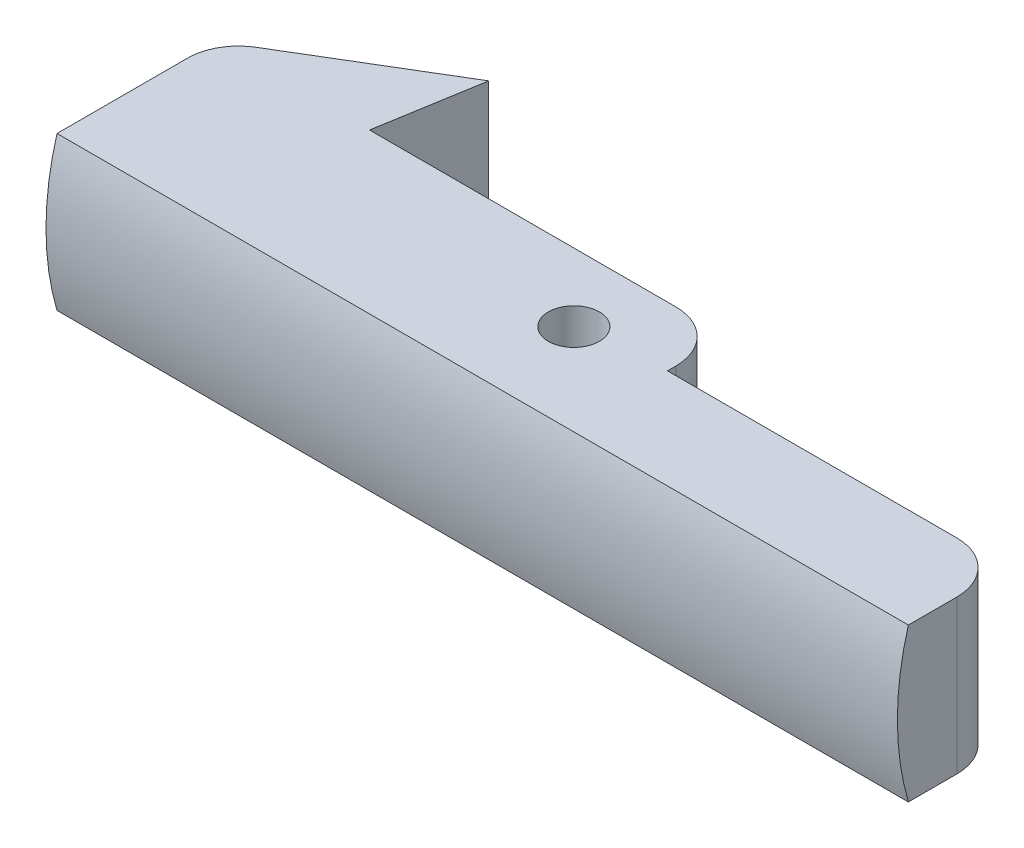
ISO-10303-21;
HEADER;
FILE_DESCRIPTION(('STEP AP214'),'2;1');
FILE_NAME('part.step','',(''),(''),'','','');
FILE_SCHEMA(('AUTOMOTIVE_DESIGN { 1 0 10303 214 1 1 1 1 }'));
ENDSEC;
DATA;
#1=APPLICATION_CONTEXT('core data for automotive mechanical design processes');
#2=APPLICATION_PROTOCOL_DEFINITION('international standard','automotive_design',2000,#1);
#3=PRODUCT_CONTEXT('',#1,'mechanical');
#4=PRODUCT('Part','Part','',(#3));
#5=PRODUCT_RELATED_PRODUCT_CATEGORY('part','',(#4));
#6=PRODUCT_DEFINITION_FORMATION('','',#4);
#7=PRODUCT_DEFINITION_CONTEXT('part definition',#1,'design');
#8=PRODUCT_DEFINITION('design','',#6,#7);
#9=PRODUCT_DEFINITION_SHAPE('','',#8);
#10=(LENGTH_UNIT() NAMED_UNIT(*) SI_UNIT(.MILLI.,.METRE.));
#11=(NAMED_UNIT(*) PLANE_ANGLE_UNIT() SI_UNIT($,.RADIAN.));
#12=(NAMED_UNIT(*) SI_UNIT($,.STERADIAN.) SOLID_ANGLE_UNIT());
#13=UNCERTAINTY_MEASURE_WITH_UNIT(LENGTH_MEASURE(1.E-05),#10,'distance_accuracy_value','');
#14=(GEOMETRIC_REPRESENTATION_CONTEXT(3) GLOBAL_UNCERTAINTY_ASSIGNED_CONTEXT((#13)) GLOBAL_UNIT_ASSIGNED_CONTEXT((#10,
#11,#12)) REPRESENTATION_CONTEXT('',''));
#15=CARTESIAN_POINT('',(0.,0.,0.));
#16=DIRECTION('',(0.,0.,1.));
#17=DIRECTION('',(1.,0.,0.));
#18=AXIS2_PLACEMENT_3D('',#15,#16,#17);
#19=CARTESIAN_POINT('',(50.,9.,-10.));
#20=DIRECTION('',(-1.,0.,0.));
#21=DIRECTION('',(0.,0.,1.));
#22=AXIS2_PLACEMENT_3D('',#19,#20,#21);
#23=PLANE('',#22);
#24=CARTESIAN_POINT('',(50.,4.5,-16.));
#25=DIRECTION('',(-1.,0.,0.));
#26=DIRECTION('',(0.,0.,1.));
#27=AXIS2_PLACEMENT_3D('',#24,#25,#26);
#28=CIRCLE('',#27,16.);
#29=CARTESIAN_POINT('',(50.,0.,-0.645847467215912));
#30=VERTEX_POINT('',#29);
#31=CARTESIAN_POINT('',(50.,9.,-0.645847467215913));
#32=VERTEX_POINT('',#31);
#33=EDGE_CURVE('E230',#30,#32,#28,.T.);
#34=ORIENTED_EDGE('',*,*,#33,.F.);
#35=DIRECTION('',(0.,0.,-1.));
#36=VECTOR('',#35,1.);
#37=CARTESIAN_POINT('',(50.,0.,-10.));
#38=LINE('',#37,#36);
#39=CARTESIAN_POINT('',(50.,0.,-3.5));
#40=VERTEX_POINT('',#39);
#41=EDGE_CURVE('E149',#30,#40,#38,.T.);
#42=ORIENTED_EDGE('',*,*,#41,.T.);
#43=DIRECTION('',(0.,1.,0.));
#44=VECTOR('',#43,1.);
#45=CARTESIAN_POINT('',(50.,9.,-3.5));
#46=LINE('',#45,#44);
#47=CARTESIAN_POINT('',(50.,9.,-3.5));
#48=VERTEX_POINT('',#47);
#49=EDGE_CURVE('E186',#40,#48,#46,.T.);
#50=ORIENTED_EDGE('',*,*,#49,.T.);
#51=DIRECTION('',(0.,0.,-1.));
#52=VECTOR('',#51,1.);
#53=CARTESIAN_POINT('',(50.,9.,-10.));
#54=LINE('',#53,#52);
#55=EDGE_CURVE('E155',#32,#48,#54,.T.);
#56=ORIENTED_EDGE('',*,*,#55,.F.);
#57=EDGE_LOOP('',(#34,#42,#50,#56));
#58=FACE_BOUND('',#57,.T.);
#59=ADVANCED_FACE('F53',(#58),#23,.F.);
#60=CARTESIAN_POINT('',(0.,9.,0.));
#61=DIRECTION('',(1.,0.,0.));
#62=DIRECTION('',(0.,0.,-1.));
#63=AXIS2_PLACEMENT_3D('',#60,#61,#62);
#64=PLANE('',#63);
#65=DIRECTION('',(0.,0.,1.));
#66=VECTOR('',#65,1.);
#67=CARTESIAN_POINT('',(0.,0.,0.));
#68=LINE('',#67,#66);
#69=CARTESIAN_POINT('',(0.,0.,-8.30142886309301));
#70=VERTEX_POINT('',#69);
#71=CARTESIAN_POINT('',(0.,0.,-0.645847467215912));
#72=VERTEX_POINT('',#71);
#73=EDGE_CURVE('E147',#70,#72,#68,.T.);
#74=ORIENTED_EDGE('',*,*,#73,.T.);
#75=CARTESIAN_POINT('',(0.,4.5,-16.));
#76=DIRECTION('',(-1.,0.,0.));
#77=DIRECTION('',(0.,0.,1.));
#78=AXIS2_PLACEMENT_3D('',#75,#76,#77);
#79=CIRCLE('',#78,16.);
#80=CARTESIAN_POINT('',(0.,9.,-0.645847467215913));
#81=VERTEX_POINT('',#80);
#82=EDGE_CURVE('E134',#72,#81,#79,.T.);
#83=ORIENTED_EDGE('',*,*,#82,.T.);
#84=DIRECTION('',(0.,0.,1.));
#85=VECTOR('',#84,1.);
#86=CARTESIAN_POINT('',(0.,9.,0.));
#87=LINE('',#86,#85);
#88=CARTESIAN_POINT('',(0.,9.,-8.30142886309301));
#89=VERTEX_POINT('',#88);
#90=EDGE_CURVE('E169',#89,#81,#87,.T.);
#91=ORIENTED_EDGE('',*,*,#90,.F.);
#92=DIRECTION('',(0.,-1.,0.));
#93=VECTOR('',#92,1.);
#94=CARTESIAN_POINT('',(0.,9.,-8.30142886309301));
#95=LINE('',#94,#93);
#96=EDGE_CURVE('E154',#89,#70,#95,.T.);
#97=ORIENTED_EDGE('',*,*,#96,.T.);
#98=EDGE_LOOP('',(#74,#83,#91,#97));
#99=FACE_BOUND('',#98,.T.);
#100=ADVANCED_FACE('F152',(#99),#64,.F.);
#101=CARTESIAN_POINT('',(0.,0.,0.));
#102=DIRECTION('',(0.,-1.,0.));
#103=DIRECTION('',(0.,0.,-1.));
#104=AXIS2_PLACEMENT_3D('',#101,#102,#103);
#105=PLANE('',#104);
#106=CARTESIAN_POINT('',(25.,0.,-6.));
#107=DIRECTION('',(0.,1.,0.));
#108=DIRECTION('',(0.,0.,1.));
#109=AXIS2_PLACEMENT_3D('',#106,#107,#108);
#110=CIRCLE('',#109,1.5);
#111=CARTESIAN_POINT('',(25.,0.,-4.5));
#112=VERTEX_POINT('',#111);
#113=EDGE_CURVE('E213',#112,#112,#110,.T.);
#114=ORIENTED_EDGE('',*,*,#113,.T.);
#115=EDGE_LOOP('',(#114));
#116=FACE_BOUND('',#115,.T.);
#117=ORIENTED_EDGE('',*,*,#41,.F.);
#118=DIRECTION('',(-1.,0.,0.));
#119=VECTOR('',#118,1.);
#120=CARTESIAN_POINT('',(51.,0.,-0.645847467215912));
#121=LINE('',#120,#119);
#122=EDGE_CURVE('E137',#30,#72,#121,.T.);
#123=ORIENTED_EDGE('',*,*,#122,.T.);
#124=ORIENTED_EDGE('',*,*,#73,.F.);
#125=CARTESIAN_POINT('',(3.,0.,-8.30142886309301));
#126=DIRECTION('',(0.,-1.,0.));
#127=DIRECTION('',(0.,0.,-1.));
#128=AXIS2_PLACEMENT_3D('',#125,#126,#127);
#129=CIRCLE('',#128,3.);
#130=CARTESIAN_POINT('',(1.45651273371746,0.,-10.8739076402307));
#131=VERTEX_POINT('',#130);
#132=EDGE_CURVE('E177',#70,#131,#129,.T.);
#133=ORIENTED_EDGE('',*,*,#132,.T.);
#134=DIRECTION('',(-0.857492925712553,0.,0.514495755427513));
#135=VECTOR('',#134,1.);
#136=CARTESIAN_POINT('',(0.,0.,-10.0000000000002));
#137=LINE('',#136,#135);
#138=CARTESIAN_POINT('',(10.,0.,-16.));
#139=VERTEX_POINT('',#138);
#140=EDGE_CURVE('E156',#139,#131,#137,.T.);
#141=ORIENTED_EDGE('',*,*,#140,.F.);
#142=DIRECTION('',(0.164398987305358,0.,-0.986393923832144));
#143=VECTOR('',#142,1.);
#144=CARTESIAN_POINT('',(10.,0.,-16.));
#145=LINE('',#144,#143);
#146=CARTESIAN_POINT('',(9.,0.,-10.));
#147=VERTEX_POINT('',#146);
#148=EDGE_CURVE('E161',#147,#139,#145,.T.);
#149=ORIENTED_EDGE('',*,*,#148,.F.);
#150=DIRECTION('',(-1.,0.,0.));
#151=VECTOR('',#150,1.);
#152=CARTESIAN_POINT('',(9.,0.,-10.));
#153=LINE('',#152,#151);
#154=CARTESIAN_POINT('',(27.,0.,-10.));
#155=VERTEX_POINT('',#154);
#156=EDGE_CURVE('E196',#155,#147,#153,.T.);
#157=ORIENTED_EDGE('',*,*,#156,.F.);
#158=CARTESIAN_POINT('',(27.,0.,-7.));
#159=DIRECTION('',(0.,-1.,0.));
#160=DIRECTION('',(0.,0.,-1.));
#161=AXIS2_PLACEMENT_3D('',#158,#159,#160);
#162=CIRCLE('',#161,3.);
#163=CARTESIAN_POINT('',(30.,0.,-7.));
#164=VERTEX_POINT('',#163);
#165=EDGE_CURVE('E173',#155,#164,#162,.T.);
#166=ORIENTED_EDGE('',*,*,#165,.T.);
#167=DIRECTION('',(0.,0.,-1.));
#168=VECTOR('',#167,1.);
#169=CARTESIAN_POINT('',(30.,0.,0.));
#170=LINE('',#169,#168);
#171=CARTESIAN_POINT('',(30.,0.,-6.5));
#172=VERTEX_POINT('',#171);
#173=EDGE_CURVE('E220',#172,#164,#170,.T.);
#174=ORIENTED_EDGE('',*,*,#173,.F.);
#175=DIRECTION('',(-1.,0.,0.));
#176=VECTOR('',#175,1.);
#177=CARTESIAN_POINT('',(0.,0.,-6.5));
#178=LINE('',#177,#176);
#179=CARTESIAN_POINT('',(47.,0.,-6.5));
#180=VERTEX_POINT('',#179);
#181=EDGE_CURVE('E216',#180,#172,#178,.T.);
#182=ORIENTED_EDGE('',*,*,#181,.F.);
#183=CARTESIAN_POINT('',(47.,0.,-3.5));
#184=DIRECTION('',(0.,-1.,0.));
#185=DIRECTION('',(0.,0.,-1.));
#186=AXIS2_PLACEMENT_3D('',#183,#184,#185);
#187=CIRCLE('',#186,3.);
#188=EDGE_CURVE('E175',#180,#40,#187,.T.);
#189=ORIENTED_EDGE('',*,*,#188,.T.);
#190=EDGE_LOOP('',(#117,#123,#124,#133,#141,#149,#157,#166,#174,#182,#189));
#191=FACE_BOUND('',#190,.T.);
#192=ADVANCED_FACE('F146',(#116,#191),#105,.T.);
#193=CARTESIAN_POINT('',(0.,9.,0.));
#194=DIRECTION('',(0.,-1.,0.));
#195=DIRECTION('',(0.,0.,-1.));
#196=AXIS2_PLACEMENT_3D('',#193,#194,#195);
#197=PLANE('',#196);
#198=CARTESIAN_POINT('',(25.,9.,-6.));
#199=DIRECTION('',(0.,1.,0.));
#200=DIRECTION('',(0.,0.,1.));
#201=AXIS2_PLACEMENT_3D('',#198,#199,#200);
#202=CIRCLE('',#201,1.5);
#203=CARTESIAN_POINT('',(25.,9.,-4.5));
#204=VERTEX_POINT('',#203);
#205=EDGE_CURVE('E203',#204,#204,#202,.T.);
#206=ORIENTED_EDGE('',*,*,#205,.F.);
#207=EDGE_LOOP('',(#206));
#208=FACE_BOUND('',#207,.T.);
#209=DIRECTION('',(-1.,0.,0.));
#210=VECTOR('',#209,1.);
#211=CARTESIAN_POINT('',(51.,9.,-0.645847467215913));
#212=LINE('',#211,#210);
#213=EDGE_CURVE('E68',#32,#81,#212,.T.);
#214=ORIENTED_EDGE('',*,*,#213,.F.);
#215=ORIENTED_EDGE('',*,*,#55,.T.);
#216=CARTESIAN_POINT('',(47.,9.,-3.5));
#217=DIRECTION('',(0.,-1.,0.));
#218=DIRECTION('',(0.,0.,-1.));
#219=AXIS2_PLACEMENT_3D('',#216,#217,#218);
#220=CIRCLE('',#219,3.);
#221=CARTESIAN_POINT('',(47.,9.,-6.5));
#222=VERTEX_POINT('',#221);
#223=EDGE_CURVE('E182',#48,#222,#220,.F.);
#224=ORIENTED_EDGE('',*,*,#223,.T.);
#225=DIRECTION('',(1.,0.,0.));
#226=VECTOR('',#225,1.);
#227=CARTESIAN_POINT('',(30.,9.,-6.5));
#228=LINE('',#227,#226);
#229=CARTESIAN_POINT('',(30.,9.,-6.5));
#230=VERTEX_POINT('',#229);
#231=EDGE_CURVE('E225',#230,#222,#228,.T.);
#232=ORIENTED_EDGE('',*,*,#231,.F.);
#233=DIRECTION('',(0.,0.,1.));
#234=VECTOR('',#233,1.);
#235=CARTESIAN_POINT('',(30.,9.,-10.));
#236=LINE('',#235,#234);
#237=CARTESIAN_POINT('',(30.,9.,-7.));
#238=VERTEX_POINT('',#237);
#239=EDGE_CURVE('E228',#238,#230,#236,.T.);
#240=ORIENTED_EDGE('',*,*,#239,.F.);
#241=CARTESIAN_POINT('',(27.,9.,-7.));
#242=DIRECTION('',(0.,-1.,0.));
#243=DIRECTION('',(0.,0.,-1.));
#244=AXIS2_PLACEMENT_3D('',#241,#242,#243);
#245=CIRCLE('',#244,3.);
#246=CARTESIAN_POINT('',(27.,9.,-10.));
#247=VERTEX_POINT('',#246);
#248=EDGE_CURVE('E76',#238,#247,#245,.F.);
#249=ORIENTED_EDGE('',*,*,#248,.T.);
#250=DIRECTION('',(-1.,0.,0.));
#251=VECTOR('',#250,1.);
#252=CARTESIAN_POINT('',(9.,9.,-10.));
#253=LINE('',#252,#251);
#254=CARTESIAN_POINT('',(9.,9.,-10.));
#255=VERTEX_POINT('',#254);
#256=EDGE_CURVE('E158',#247,#255,#253,.T.);
#257=ORIENTED_EDGE('',*,*,#256,.T.);
#258=DIRECTION('',(0.164398987305358,0.,-0.986393923832144));
#259=VECTOR('',#258,1.);
#260=CARTESIAN_POINT('',(10.,9.,-16.));
#261=LINE('',#260,#259);
#262=CARTESIAN_POINT('',(10.,9.,-16.));
#263=VERTEX_POINT('',#262);
#264=EDGE_CURVE('E210',#255,#263,#261,.T.);
#265=ORIENTED_EDGE('',*,*,#264,.T.);
#266=DIRECTION('',(-0.857492925712553,0.,0.514495755427513));
#267=VECTOR('',#266,1.);
#268=CARTESIAN_POINT('',(0.,9.,-10.0000000000002));
#269=LINE('',#268,#267);
#270=CARTESIAN_POINT('',(1.45651273371746,9.,-10.8739076402307));
#271=VERTEX_POINT('',#270);
#272=EDGE_CURVE('E207',#263,#271,#269,.T.);
#273=ORIENTED_EDGE('',*,*,#272,.T.);
#274=CARTESIAN_POINT('',(3.,9.,-8.30142886309301));
#275=DIRECTION('',(0.,-1.,0.));
#276=DIRECTION('',(0.,0.,-1.));
#277=AXIS2_PLACEMENT_3D('',#274,#275,#276);
#278=CIRCLE('',#277,3.);
#279=EDGE_CURVE('E184',#271,#89,#278,.F.);
#280=ORIENTED_EDGE('',*,*,#279,.T.);
#281=ORIENTED_EDGE('',*,*,#90,.T.);
#282=EDGE_LOOP('',(#214,#215,#224,#232,#240,#249,#257,#265,#273,#280,#281));
#283=FACE_BOUND('',#282,.T.);
#284=ADVANCED_FACE('F234',(#208,#283),#197,.F.);
#285=CARTESIAN_POINT('',(9.,9.,-10.));
#286=DIRECTION('',(0.,0.,1.));
#287=DIRECTION('',(1.,0.,0.));
#288=AXIS2_PLACEMENT_3D('',#285,#286,#287);
#289=PLANE('',#288);
#290=ORIENTED_EDGE('',*,*,#256,.F.);
#291=DIRECTION('',(0.,-1.,0.));
#292=VECTOR('',#291,1.);
#293=CARTESIAN_POINT('',(27.,9.,-10.));
#294=LINE('',#293,#292);
#295=EDGE_CURVE('E61',#247,#155,#294,.T.);
#296=ORIENTED_EDGE('',*,*,#295,.T.);
#297=ORIENTED_EDGE('',*,*,#156,.T.);
#298=DIRECTION('',(0.,-1.,0.));
#299=VECTOR('',#298,1.);
#300=CARTESIAN_POINT('',(9.,9.,-10.));
#301=LINE('',#300,#299);
#302=EDGE_CURVE('E168',#255,#147,#301,.T.);
#303=ORIENTED_EDGE('',*,*,#302,.F.);
#304=EDGE_LOOP('',(#290,#296,#297,#303));
#305=FACE_BOUND('',#304,.T.);
#306=ADVANCED_FACE('F194',(#305),#289,.F.);
#307=CARTESIAN_POINT('',(10.,9.,-16.));
#308=DIRECTION('',(-0.986393923832144,0.,-0.164398987305358));
#309=DIRECTION('',(-0.164398987305358,0.,0.986393923832144));
#310=AXIS2_PLACEMENT_3D('',#307,#308,#309);
#311=PLANE('',#310);
#312=ORIENTED_EDGE('',*,*,#148,.T.);
#313=DIRECTION('',(0.,-1.,0.));
#314=VECTOR('',#313,1.);
#315=CARTESIAN_POINT('',(10.,9.,-16.));
#316=LINE('',#315,#314);
#317=EDGE_CURVE('E165',#263,#139,#316,.T.);
#318=ORIENTED_EDGE('',*,*,#317,.F.);
#319=ORIENTED_EDGE('',*,*,#264,.F.);
#320=ORIENTED_EDGE('',*,*,#302,.T.);
#321=EDGE_LOOP('',(#312,#318,#319,#320));
#322=FACE_BOUND('',#321,.T.);
#323=ADVANCED_FACE('F279',(#322),#311,.F.);
#324=CARTESIAN_POINT('',(0.,9.,-10.0000000000002));
#325=DIRECTION('',(0.514495755427513,0.,0.857492925712552));
#326=DIRECTION('',(0.857492925712552,0.,-0.514495755427513));
#327=AXIS2_PLACEMENT_3D('',#324,#325,#326);
#328=PLANE('',#327);
#329=ORIENTED_EDGE('',*,*,#140,.T.);
#330=DIRECTION('',(0.,-1.,0.));
#331=VECTOR('',#330,1.);
#332=CARTESIAN_POINT('',(1.45651273371746,9.,-10.8739076402307));
#333=LINE('',#332,#331);
#334=EDGE_CURVE('E179',#131,#271,#333,.F.);
#335=ORIENTED_EDGE('',*,*,#334,.T.);
#336=ORIENTED_EDGE('',*,*,#272,.F.);
#337=ORIENTED_EDGE('',*,*,#317,.T.);
#338=EDGE_LOOP('',(#329,#335,#336,#337));
#339=FACE_BOUND('',#338,.T.);
#340=ADVANCED_FACE('F277',(#339),#328,.F.);
#341=CARTESIAN_POINT('',(25.,9.,-6.));
#342=DIRECTION('',(0.,-1.,0.));
#343=DIRECTION('',(0.,0.,-1.));
#344=AXIS2_PLACEMENT_3D('',#341,#342,#343);
#345=CYLINDRICAL_SURFACE('',#344,1.5);
#346=ORIENTED_EDGE('',*,*,#205,.T.);
#347=EDGE_LOOP('',(#346));
#348=FACE_BOUND('',#347,.T.);
#349=ORIENTED_EDGE('',*,*,#113,.F.);
#350=EDGE_LOOP('',(#349));
#351=FACE_BOUND('',#350,.T.);
#352=ADVANCED_FACE('F285',(#348,#351),#345,.F.);
#353=CARTESIAN_POINT('',(30.,-9.,-6.5));
#354=DIRECTION('',(0.,0.,1.));
#355=DIRECTION('',(1.,0.,0.));
#356=AXIS2_PLACEMENT_3D('',#353,#354,#355);
#357=PLANE('',#356);
#358=ORIENTED_EDGE('',*,*,#231,.T.);
#359=DIRECTION('',(0.,1.,0.));
#360=VECTOR('',#359,1.);
#361=CARTESIAN_POINT('',(47.,-9.,-6.5));
#362=LINE('',#361,#360);
#363=EDGE_CURVE('E189',#222,#180,#362,.F.);
#364=ORIENTED_EDGE('',*,*,#363,.T.);
#365=ORIENTED_EDGE('',*,*,#181,.T.);
#366=DIRECTION('',(0.,1.,0.));
#367=VECTOR('',#366,1.);
#368=CARTESIAN_POINT('',(30.,-9.,-6.5));
#369=LINE('',#368,#367);
#370=EDGE_CURVE('E222',#172,#230,#369,.T.);
#371=ORIENTED_EDGE('',*,*,#370,.T.);
#372=EDGE_LOOP('',(#358,#364,#365,#371));
#373=FACE_BOUND('',#372,.T.);
#374=ADVANCED_FACE('F243',(#373),#357,.F.);
#375=CARTESIAN_POINT('',(30.,-9.,-10.));
#376=DIRECTION('',(-1.,0.,0.));
#377=DIRECTION('',(0.,0.,1.));
#378=AXIS2_PLACEMENT_3D('',#375,#376,#377);
#379=PLANE('',#378);
#380=ORIENTED_EDGE('',*,*,#173,.T.);
#381=DIRECTION('',(0.,-1.,0.));
#382=VECTOR('',#381,1.);
#383=CARTESIAN_POINT('',(30.,-9.,-7.));
#384=LINE('',#383,#382);
#385=EDGE_CURVE('E12',#164,#238,#384,.F.);
#386=ORIENTED_EDGE('',*,*,#385,.T.);
#387=ORIENTED_EDGE('',*,*,#239,.T.);
#388=ORIENTED_EDGE('',*,*,#370,.F.);
#389=EDGE_LOOP('',(#380,#386,#387,#388));
#390=FACE_BOUND('',#389,.T.);
#391=ADVANCED_FACE('F247',(#390),#379,.F.);
#392=CARTESIAN_POINT('',(3.,9.,-8.30142886309301));
#393=DIRECTION('',(0.,-1.,0.));
#394=DIRECTION('',(0.,0.,-1.));
#395=AXIS2_PLACEMENT_3D('',#392,#393,#394);
#396=CYLINDRICAL_SURFACE('',#395,3.);
#397=ORIENTED_EDGE('',*,*,#279,.F.);
#398=ORIENTED_EDGE('',*,*,#334,.F.);
#399=ORIENTED_EDGE('',*,*,#132,.F.);
#400=ORIENTED_EDGE('',*,*,#96,.F.);
#401=EDGE_LOOP('',(#397,#398,#399,#400));
#402=FACE_BOUND('',#401,.T.);
#403=ADVANCED_FACE('F255',(#402),#396,.T.);
#404=CARTESIAN_POINT('',(47.,9.,-3.5));
#405=DIRECTION('',(0.,1.,0.));
#406=DIRECTION('',(0.,0.,1.));
#407=AXIS2_PLACEMENT_3D('',#404,#405,#406);
#408=CYLINDRICAL_SURFACE('',#407,3.);
#409=ORIENTED_EDGE('',*,*,#188,.F.);
#410=ORIENTED_EDGE('',*,*,#363,.F.);
#411=ORIENTED_EDGE('',*,*,#223,.F.);
#412=ORIENTED_EDGE('',*,*,#49,.F.);
#413=EDGE_LOOP('',(#409,#410,#411,#412));
#414=FACE_BOUND('',#413,.T.);
#415=ADVANCED_FACE('F239',(#414),#408,.T.);
#416=CARTESIAN_POINT('',(27.,9.,-7.));
#417=DIRECTION('',(0.,-1.,0.));
#418=DIRECTION('',(0.,0.,-1.));
#419=AXIS2_PLACEMENT_3D('',#416,#417,#418);
#420=CYLINDRICAL_SURFACE('',#419,3.);
#421=ORIENTED_EDGE('',*,*,#248,.F.);
#422=ORIENTED_EDGE('',*,*,#385,.F.);
#423=ORIENTED_EDGE('',*,*,#165,.F.);
#424=ORIENTED_EDGE('',*,*,#295,.F.);
#425=EDGE_LOOP('',(#421,#422,#423,#424));
#426=FACE_BOUND('',#425,.T.);
#427=ADVANCED_FACE('F55',(#426),#420,.T.);
#428=CARTESIAN_POINT('',(51.,4.5,-16.));
#429=DIRECTION('',(-1.,0.,0.));
#430=DIRECTION('',(0.,0.,1.));
#431=AXIS2_PLACEMENT_3D('',#428,#429,#430);
#432=CYLINDRICAL_SURFACE('',#431,16.);
#433=ORIENTED_EDGE('',*,*,#33,.T.);
#434=ORIENTED_EDGE('',*,*,#213,.T.);
#435=ORIENTED_EDGE('',*,*,#82,.F.);
#436=ORIENTED_EDGE('',*,*,#122,.F.);
#437=EDGE_LOOP('',(#433,#434,#435,#436));
#438=FACE_BOUND('',#437,.T.);
#439=ADVANCED_FACE('F136',(#438),#432,.T.);
#440=CLOSED_SHELL('',(#59,#100,#192,#284,#306,#323,#340,#352,#374,#391,#403,#415,#427,#439));
#441=MANIFOLD_SOLID_BREP('B2',#440);
#442=ADVANCED_BREP_SHAPE_REPRESENTATION('',(#18,#441),#14);
#443=SHAPE_DEFINITION_REPRESENTATION(#9,#442);
ENDSEC;
END-ISO-10303-21;
